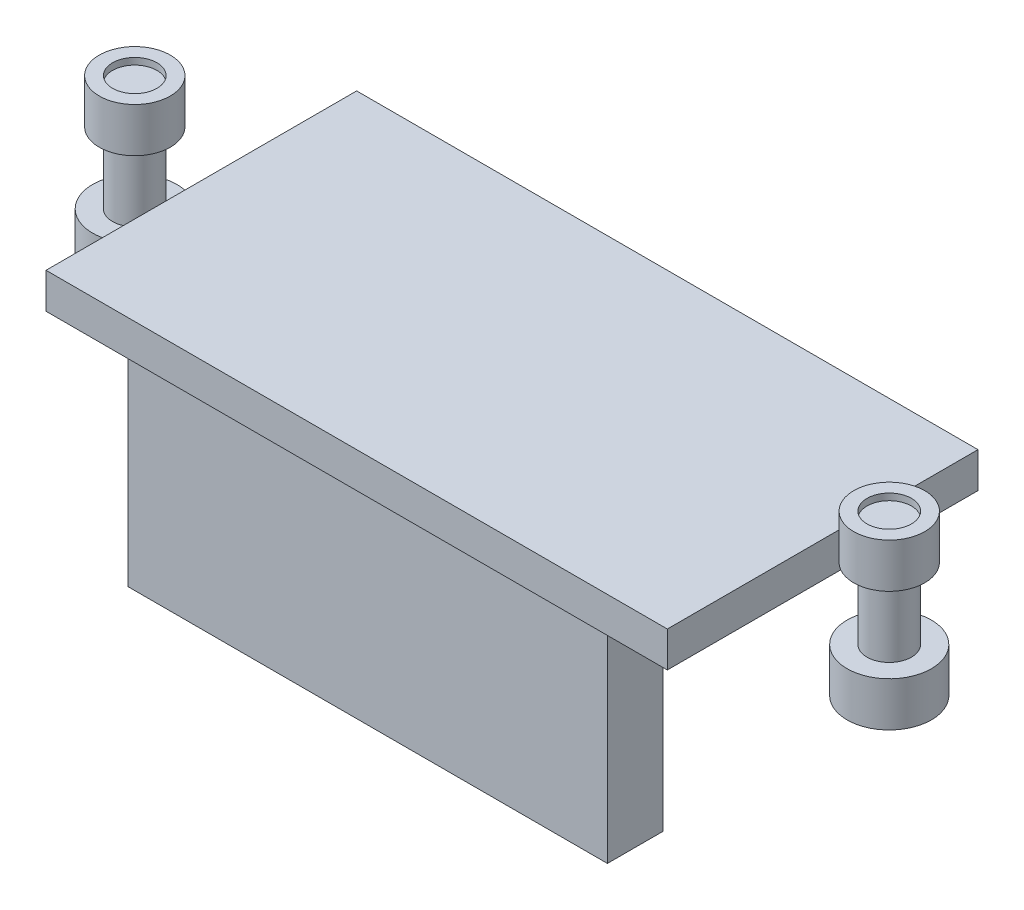
ISO-10303-21;
HEADER;
FILE_DESCRIPTION(('STEP AP214'),'2;1');
FILE_NAME('part.step','',(''),(''),'','','');
FILE_SCHEMA(('AUTOMOTIVE_DESIGN { 1 0 10303 214 1 1 1 1 }'));
ENDSEC;
DATA;
#1=APPLICATION_CONTEXT('core data for automotive mechanical design processes');
#2=APPLICATION_PROTOCOL_DEFINITION('international standard','automotive_design',2000,#1);
#3=PRODUCT_CONTEXT('',#1,'mechanical');
#4=PRODUCT('Part','Part','',(#3));
#5=PRODUCT_RELATED_PRODUCT_CATEGORY('part','',(#4));
#6=PRODUCT_DEFINITION_FORMATION('','',#4);
#7=PRODUCT_DEFINITION_CONTEXT('part definition',#1,'design');
#8=PRODUCT_DEFINITION('design','',#6,#7);
#9=PRODUCT_DEFINITION_SHAPE('','',#8);
#10=(LENGTH_UNIT() NAMED_UNIT(*) SI_UNIT(.MILLI.,.METRE.));
#11=(NAMED_UNIT(*) PLANE_ANGLE_UNIT() SI_UNIT($,.RADIAN.));
#12=(NAMED_UNIT(*) SI_UNIT($,.STERADIAN.) SOLID_ANGLE_UNIT());
#13=UNCERTAINTY_MEASURE_WITH_UNIT(LENGTH_MEASURE(1.E-05),#10,'distance_accuracy_value','');
#14=(GEOMETRIC_REPRESENTATION_CONTEXT(3) GLOBAL_UNCERTAINTY_ASSIGNED_CONTEXT((#13)) GLOBAL_UNIT_ASSIGNED_CONTEXT((#10,
#11,#12)) REPRESENTATION_CONTEXT('',''));
#15=CARTESIAN_POINT('',(0.,0.,0.));
#16=DIRECTION('',(0.,0.,1.));
#17=DIRECTION('',(1.,0.,0.));
#18=AXIS2_PLACEMENT_3D('',#15,#16,#17);
#19=CARTESIAN_POINT('',(-33.00918288317,-244.6,-36.24488287878));
#20=DIRECTION('',(0.,-1.,0.));
#21=DIRECTION('',(0.,0.,-1.));
#22=AXIS2_PLACEMENT_3D('',#19,#20,#21);
#23=PLANE('',#22);
#24=DIRECTION('',(0.,0.,1.));
#25=VECTOR('',#24,1.);
#26=CARTESIAN_POINT('',(-33.00918288317,-244.6,-36.24488287878));
#27=LINE('',#26,#25);
#28=CARTESIAN_POINT('',(-33.00918288317,-244.6,-36.24488287878));
#29=VERTEX_POINT('',#28);
#30=CARTESIAN_POINT('',(-33.00918288317,-244.6,-22.24488287878));
#31=VERTEX_POINT('',#30);
#32=EDGE_CURVE('P0_E83',#29,#31,#27,.T.);
#33=ORIENTED_EDGE('',*,*,#32,.F.);
#34=DIRECTION('',(1.,0.,0.));
#35=VECTOR('',#34,1.);
#36=CARTESIAN_POINT('',(-33.00918288317,-244.6,-36.24488287878));
#37=LINE('',#36,#35);
#38=CARTESIAN_POINT('',(-5.009182883171,-244.6,-36.24488287878));
#39=VERTEX_POINT('',#38);
#40=EDGE_CURVE('P0_E65',#29,#39,#37,.T.);
#41=ORIENTED_EDGE('',*,*,#40,.T.);
#42=DIRECTION('',(0.,0.,1.));
#43=VECTOR('',#42,1.);
#44=CARTESIAN_POINT('',(-5.009182883171,-244.6,-36.24488287878));
#45=LINE('',#44,#43);
#46=CARTESIAN_POINT('',(-5.009182883171,-244.6,-22.24488287878));
#47=VERTEX_POINT('',#46);
#48=EDGE_CURVE('P0_E80',#39,#47,#45,.T.);
#49=ORIENTED_EDGE('',*,*,#48,.T.);
#50=DIRECTION('',(1.,0.,0.));
#51=VECTOR('',#50,1.);
#52=CARTESIAN_POINT('',(-33.00918288317,-244.6,-22.24488287878));
#53=LINE('',#52,#51);
#54=EDGE_CURVE('P0_E11',#31,#47,#53,.T.);
#55=ORIENTED_EDGE('',*,*,#54,.F.);
#56=EDGE_LOOP('',(#33,#41,#49,#55));
#57=FACE_BOUND('',#56,.T.);
#58=ADVANCED_FACE('P0_F17',(#57),#23,.T.);
#59=CARTESIAN_POINT('',(-33.00918288317,-243.,-36.24488287878));
#60=DIRECTION('',(0.,-1.,0.));
#61=DIRECTION('',(0.,0.,-1.));
#62=AXIS2_PLACEMENT_3D('',#59,#60,#61);
#63=PLANE('',#62);
#64=DIRECTION('',(1.,0.,0.));
#65=VECTOR('',#64,1.);
#66=CARTESIAN_POINT('',(-33.00918288317,-243.,-22.24488287878));
#67=LINE('',#66,#65);
#68=CARTESIAN_POINT('',(-33.00918288317,-243.,-22.24488287878));
#69=VERTEX_POINT('',#68);
#70=CARTESIAN_POINT('',(-5.009182883171,-243.,-22.24488287878));
#71=VERTEX_POINT('',#70);
#72=EDGE_CURVE('P0_E27',#69,#71,#67,.T.);
#73=ORIENTED_EDGE('',*,*,#72,.T.);
#74=DIRECTION('',(0.,0.,1.));
#75=VECTOR('',#74,1.);
#76=CARTESIAN_POINT('',(-5.009182883171,-243.,-36.24488287878));
#77=LINE('',#76,#75);
#78=CARTESIAN_POINT('',(-5.009182883171,-243.,-36.24488287878));
#79=VERTEX_POINT('',#78);
#80=EDGE_CURVE('P0_E101',#79,#71,#77,.T.);
#81=ORIENTED_EDGE('',*,*,#80,.F.);
#82=DIRECTION('',(1.,0.,0.));
#83=VECTOR('',#82,1.);
#84=CARTESIAN_POINT('',(-33.00918288317,-243.,-36.24488287878));
#85=LINE('',#84,#83);
#86=CARTESIAN_POINT('',(-33.00918288317,-243.,-36.24488287878));
#87=VERTEX_POINT('',#86);
#88=EDGE_CURVE('P0_E76',#87,#79,#85,.T.);
#89=ORIENTED_EDGE('',*,*,#88,.F.);
#90=DIRECTION('',(0.,0.,1.));
#91=VECTOR('',#90,1.);
#92=CARTESIAN_POINT('',(-33.00918288317,-243.,-36.24488287878));
#93=LINE('',#92,#91);
#94=EDGE_CURVE('P0_E84',#87,#69,#93,.T.);
#95=ORIENTED_EDGE('',*,*,#94,.T.);
#96=EDGE_LOOP('',(#73,#81,#89,#95));
#97=FACE_BOUND('',#96,.T.);
#98=ADVANCED_FACE('P0_F111',(#97),#63,.F.);
#99=CARTESIAN_POINT('',(-33.00918288317,-243.,-22.24488287878));
#100=DIRECTION('',(0.,0.,1.));
#101=DIRECTION('',(1.,0.,0.));
#102=AXIS2_PLACEMENT_3D('',#99,#100,#101);
#103=PLANE('',#102);
#104=ORIENTED_EDGE('',*,*,#72,.F.);
#105=DIRECTION('',(0.,-1.,0.));
#106=VECTOR('',#105,1.);
#107=CARTESIAN_POINT('',(-33.00918288317,-243.,-22.24488287878));
#108=LINE('',#107,#106);
#109=EDGE_CURVE('P0_E90',#69,#31,#108,.T.);
#110=ORIENTED_EDGE('',*,*,#109,.T.);
#111=ORIENTED_EDGE('',*,*,#54,.T.);
#112=DIRECTION('',(0.,-1.,0.));
#113=VECTOR('',#112,1.);
#114=CARTESIAN_POINT('',(-5.009182883171,-243.,-22.24488287878));
#115=LINE('',#114,#113);
#116=EDGE_CURVE('P0_E100',#71,#47,#115,.T.);
#117=ORIENTED_EDGE('',*,*,#116,.F.);
#118=EDGE_LOOP('',(#104,#110,#111,#117));
#119=FACE_BOUND('',#118,.T.);
#120=ADVANCED_FACE('P0_F113',(#119),#103,.T.);
#121=CARTESIAN_POINT('',(-33.00918288317,-243.,-36.24488287878));
#122=DIRECTION('',(0.,0.,1.));
#123=DIRECTION('',(1.,0.,0.));
#124=AXIS2_PLACEMENT_3D('',#121,#122,#123);
#125=PLANE('',#124);
#126=DIRECTION('',(0.,-1.,0.));
#127=VECTOR('',#126,1.);
#128=CARTESIAN_POINT('',(-5.009182883171,-243.,-36.24488287878));
#129=LINE('',#128,#127);
#130=EDGE_CURVE('P0_E75',#79,#39,#129,.T.);
#131=ORIENTED_EDGE('',*,*,#130,.T.);
#132=ORIENTED_EDGE('',*,*,#40,.F.);
#133=DIRECTION('',(0.,-1.,0.));
#134=VECTOR('',#133,1.);
#135=CARTESIAN_POINT('',(-33.00918288317,-243.,-36.24488287878));
#136=LINE('',#135,#134);
#137=EDGE_CURVE('P0_E68',#87,#29,#136,.T.);
#138=ORIENTED_EDGE('',*,*,#137,.F.);
#139=ORIENTED_EDGE('',*,*,#88,.T.);
#140=EDGE_LOOP('',(#131,#132,#138,#139));
#141=FACE_BOUND('',#140,.T.);
#142=ADVANCED_FACE('P0_F70',(#141),#125,.F.);
#143=CARTESIAN_POINT('',(-5.009182883171,-243.,-36.24488287878));
#144=DIRECTION('',(1.,0.,0.));
#145=DIRECTION('',(0.,1.,0.));
#146=AXIS2_PLACEMENT_3D('',#143,#144,#145);
#147=PLANE('',#146);
#148=ORIENTED_EDGE('',*,*,#130,.F.);
#149=ORIENTED_EDGE('',*,*,#80,.T.);
#150=ORIENTED_EDGE('',*,*,#116,.T.);
#151=ORIENTED_EDGE('',*,*,#48,.F.);
#152=EDGE_LOOP('',(#148,#149,#150,#151));
#153=FACE_BOUND('',#152,.T.);
#154=ADVANCED_FACE('P0_F117',(#153),#147,.T.);
#155=CARTESIAN_POINT('',(-33.00918288317,-243.,-36.24488287878));
#156=DIRECTION('',(1.,0.,0.));
#157=DIRECTION('',(0.,1.,0.));
#158=AXIS2_PLACEMENT_3D('',#155,#156,#157);
#159=PLANE('',#158);
#160=ORIENTED_EDGE('',*,*,#32,.T.);
#161=ORIENTED_EDGE('',*,*,#109,.F.);
#162=ORIENTED_EDGE('',*,*,#94,.F.);
#163=ORIENTED_EDGE('',*,*,#137,.T.);
#164=EDGE_LOOP('',(#160,#161,#162,#163));
#165=FACE_BOUND('',#164,.T.);
#166=ADVANCED_FACE('P0_F81',(#165),#159,.F.);
#167=CLOSED_SHELL('',(#58,#98,#120,#142,#154,#166));
#168=MANIFOLD_SOLID_BREP('P0_B1',#167);
#169=CARTESIAN_POINT('',(-21.50918288317,-245.6,-30.74488287878));
#170=DIRECTION('',(0.,-1.,0.));
#171=DIRECTION('',(0.,0.,-1.));
#172=AXIS2_PLACEMENT_3D('',#169,#170,#171);
#173=PLANE('',#172);
#174=DIRECTION('',(0.,0.,1.));
#175=VECTOR('',#174,1.);
#176=CARTESIAN_POINT('',(-21.50918288317,-245.6,-30.74488287878));
#177=LINE('',#176,#175);
#178=CARTESIAN_POINT('',(-21.50918288317,-245.6,-30.74488287878));
#179=VERTEX_POINT('',#178);
#180=CARTESIAN_POINT('',(-21.50918288317,-245.6,-27.74488287878));
#181=VERTEX_POINT('',#180);
#182=EDGE_CURVE('P1_E69',#179,#181,#177,.T.);
#183=ORIENTED_EDGE('',*,*,#182,.F.);
#184=DIRECTION('',(1.,0.,0.));
#185=VECTOR('',#184,1.);
#186=CARTESIAN_POINT('',(-21.50918288317,-245.6,-30.74488287878));
#187=LINE('',#186,#185);
#188=CARTESIAN_POINT('',(-16.50918288317,-245.6,-30.74488287878));
#189=VERTEX_POINT('',#188);
#190=EDGE_CURVE('P1_E65',#179,#189,#187,.T.);
#191=ORIENTED_EDGE('',*,*,#190,.T.);
#192=DIRECTION('',(0.,0.,1.));
#193=VECTOR('',#192,1.);
#194=CARTESIAN_POINT('',(-16.50918288317,-245.6,-30.74488287878));
#195=LINE('',#194,#193);
#196=CARTESIAN_POINT('',(-16.50918288317,-245.6,-27.74488287878));
#197=VERTEX_POINT('',#196);
#198=EDGE_CURVE('P1_E70',#189,#197,#195,.T.);
#199=ORIENTED_EDGE('',*,*,#198,.T.);
#200=DIRECTION('',(1.,0.,0.));
#201=VECTOR('',#200,1.);
#202=CARTESIAN_POINT('',(-21.50918288317,-245.6,-27.74488287878));
#203=LINE('',#202,#201);
#204=EDGE_CURVE('P1_E11',#181,#197,#203,.T.);
#205=ORIENTED_EDGE('',*,*,#204,.F.);
#206=EDGE_LOOP('',(#183,#191,#199,#205));
#207=FACE_BOUND('',#206,.T.);
#208=ADVANCED_FACE('P1_F17',(#207),#173,.T.);
#209=CARTESIAN_POINT('',(-21.50918288317,-244.6,-30.74488287878));
#210=DIRECTION('',(0.,-1.,0.));
#211=DIRECTION('',(0.,0.,-1.));
#212=AXIS2_PLACEMENT_3D('',#209,#210,#211);
#213=PLANE('',#212);
#214=DIRECTION('',(1.,0.,0.));
#215=VECTOR('',#214,1.);
#216=CARTESIAN_POINT('',(-21.50918288317,-244.6,-27.74488287878));
#217=LINE('',#216,#215);
#218=CARTESIAN_POINT('',(-21.50918288317,-244.6,-27.74488287878));
#219=VERTEX_POINT('',#218);
#220=CARTESIAN_POINT('',(-16.50918288317,-244.6,-27.74488287878));
#221=VERTEX_POINT('',#220);
#222=EDGE_CURVE('P1_E20',#219,#221,#217,.T.);
#223=ORIENTED_EDGE('',*,*,#222,.T.);
#224=DIRECTION('',(0.,0.,1.));
#225=VECTOR('',#224,1.);
#226=CARTESIAN_POINT('',(-16.50918288317,-244.6,-30.74488287878));
#227=LINE('',#226,#225);
#228=CARTESIAN_POINT('',(-16.50918288317,-244.6,-30.74488287878));
#229=VERTEX_POINT('',#228);
#230=EDGE_CURVE('P1_E90',#229,#221,#227,.T.);
#231=ORIENTED_EDGE('',*,*,#230,.F.);
#232=DIRECTION('',(1.,0.,0.));
#233=VECTOR('',#232,1.);
#234=CARTESIAN_POINT('',(-21.50918288317,-244.6,-30.74488287878));
#235=LINE('',#234,#233);
#236=CARTESIAN_POINT('',(-21.50918288317,-244.6,-30.74488287878));
#237=VERTEX_POINT('',#236);
#238=EDGE_CURVE('P1_E76',#237,#229,#235,.T.);
#239=ORIENTED_EDGE('',*,*,#238,.F.);
#240=DIRECTION('',(0.,0.,1.));
#241=VECTOR('',#240,1.);
#242=CARTESIAN_POINT('',(-21.50918288317,-244.6,-30.74488287878));
#243=LINE('',#242,#241);
#244=EDGE_CURVE('P1_E96',#237,#219,#243,.T.);
#245=ORIENTED_EDGE('',*,*,#244,.T.);
#246=EDGE_LOOP('',(#223,#231,#239,#245));
#247=FACE_BOUND('',#246,.T.);
#248=ADVANCED_FACE('P1_F104',(#247),#213,.F.);
#249=CARTESIAN_POINT('',(-21.50918288317,-244.6,-27.74488287878));
#250=DIRECTION('',(0.,0.,1.));
#251=DIRECTION('',(1.,0.,0.));
#252=AXIS2_PLACEMENT_3D('',#249,#250,#251);
#253=PLANE('',#252);
#254=ORIENTED_EDGE('',*,*,#222,.F.);
#255=DIRECTION('',(0.,-1.,0.));
#256=VECTOR('',#255,1.);
#257=CARTESIAN_POINT('',(-21.50918288317,-244.6,-27.74488287878));
#258=LINE('',#257,#256);
#259=EDGE_CURVE('P1_E116',#219,#181,#258,.T.);
#260=ORIENTED_EDGE('',*,*,#259,.T.);
#261=ORIENTED_EDGE('',*,*,#204,.T.);
#262=DIRECTION('',(0.,-1.,0.));
#263=VECTOR('',#262,1.);
#264=CARTESIAN_POINT('',(-16.50918288317,-244.6,-27.74488287878));
#265=LINE('',#264,#263);
#266=EDGE_CURVE('P1_E83',#221,#197,#265,.T.);
#267=ORIENTED_EDGE('',*,*,#266,.F.);
#268=EDGE_LOOP('',(#254,#260,#261,#267));
#269=FACE_BOUND('',#268,.T.);
#270=ADVANCED_FACE('P1_F107',(#269),#253,.T.);
#271=CARTESIAN_POINT('',(-21.50918288317,-244.6,-30.74488287878));
#272=DIRECTION('',(0.,0.,1.));
#273=DIRECTION('',(1.,0.,0.));
#274=AXIS2_PLACEMENT_3D('',#271,#272,#273);
#275=PLANE('',#274);
#276=DIRECTION('',(0.,-1.,0.));
#277=VECTOR('',#276,1.);
#278=CARTESIAN_POINT('',(-16.50918288317,-244.6,-30.74488287878));
#279=LINE('',#278,#277);
#280=EDGE_CURVE('P1_E85',#229,#189,#279,.T.);
#281=ORIENTED_EDGE('',*,*,#280,.T.);
#282=ORIENTED_EDGE('',*,*,#190,.F.);
#283=DIRECTION('',(0.,-1.,0.));
#284=VECTOR('',#283,1.);
#285=CARTESIAN_POINT('',(-21.50918288317,-244.6,-30.74488287878));
#286=LINE('',#285,#284);
#287=EDGE_CURVE('P1_E89',#237,#179,#286,.T.);
#288=ORIENTED_EDGE('',*,*,#287,.F.);
#289=ORIENTED_EDGE('',*,*,#238,.T.);
#290=EDGE_LOOP('',(#281,#282,#288,#289));
#291=FACE_BOUND('',#290,.T.);
#292=ADVANCED_FACE('P1_F88',(#291),#275,.F.);
#293=CARTESIAN_POINT('',(-16.50918288317,-244.6,-30.74488287878));
#294=DIRECTION('',(1.,0.,0.));
#295=DIRECTION('',(0.,1.,0.));
#296=AXIS2_PLACEMENT_3D('',#293,#294,#295);
#297=PLANE('',#296);
#298=ORIENTED_EDGE('',*,*,#280,.F.);
#299=ORIENTED_EDGE('',*,*,#230,.T.);
#300=ORIENTED_EDGE('',*,*,#266,.T.);
#301=ORIENTED_EDGE('',*,*,#198,.F.);
#302=EDGE_LOOP('',(#298,#299,#300,#301));
#303=FACE_BOUND('',#302,.T.);
#304=ADVANCED_FACE('P1_F79',(#303),#297,.T.);
#305=CARTESIAN_POINT('',(-21.50918288317,-244.6,-30.74488287878));
#306=DIRECTION('',(1.,0.,0.));
#307=DIRECTION('',(0.,1.,0.));
#308=AXIS2_PLACEMENT_3D('',#305,#306,#307);
#309=PLANE('',#308);
#310=ORIENTED_EDGE('',*,*,#182,.T.);
#311=ORIENTED_EDGE('',*,*,#259,.F.);
#312=ORIENTED_EDGE('',*,*,#244,.F.);
#313=ORIENTED_EDGE('',*,*,#287,.T.);
#314=EDGE_LOOP('',(#310,#311,#312,#313));
#315=FACE_BOUND('',#314,.T.);
#316=ADVANCED_FACE('P1_F123',(#315),#309,.F.);
#317=CLOSED_SHELL('',(#208,#248,#270,#292,#304,#316));
#318=MANIFOLD_SOLID_BREP('P1_B1',#317);
#319=CARTESIAN_POINT('',(-29.80918288317,-254.,-25.24488287878));
#320=DIRECTION('',(0.,-1.,0.));
#321=DIRECTION('',(0.,0.,-1.));
#322=AXIS2_PLACEMENT_3D('',#319,#320,#321);
#323=PLANE('',#322);
#324=DIRECTION('',(0.,0.,1.));
#325=VECTOR('',#324,1.);
#326=CARTESIAN_POINT('',(-29.80918288317,-254.,-25.24488287878));
#327=LINE('',#326,#325);
#328=CARTESIAN_POINT('',(-29.80918288317,-254.,-25.24488287878));
#329=VERTEX_POINT('',#328);
#330=CARTESIAN_POINT('',(-29.80918288317,-254.,-22.74488287878));
#331=VERTEX_POINT('',#330);
#332=EDGE_CURVE('P2_E90',#329,#331,#327,.T.);
#333=ORIENTED_EDGE('',*,*,#332,.F.);
#334=DIRECTION('',(1.,0.,0.));
#335=VECTOR('',#334,1.);
#336=CARTESIAN_POINT('',(-29.80918288317,-254.,-25.24488287878));
#337=LINE('',#336,#335);
#338=CARTESIAN_POINT('',(-8.209182883171,-254.,-25.24488287878));
#339=VERTEX_POINT('',#338);
#340=EDGE_CURVE('P2_E75',#329,#339,#337,.T.);
#341=ORIENTED_EDGE('',*,*,#340,.T.);
#342=DIRECTION('',(0.,0.,1.));
#343=VECTOR('',#342,1.);
#344=CARTESIAN_POINT('',(-8.209182883171,-254.,-25.24488287878));
#345=LINE('',#344,#343);
#346=CARTESIAN_POINT('',(-8.209182883171,-254.,-22.74488287878));
#347=VERTEX_POINT('',#346);
#348=EDGE_CURVE('P2_E83',#339,#347,#345,.T.);
#349=ORIENTED_EDGE('',*,*,#348,.T.);
#350=DIRECTION('',(1.,0.,0.));
#351=VECTOR('',#350,1.);
#352=CARTESIAN_POINT('',(-29.80918288317,-254.,-22.74488287878));
#353=LINE('',#352,#351);
#354=EDGE_CURVE('P2_E11',#331,#347,#353,.T.);
#355=ORIENTED_EDGE('',*,*,#354,.F.);
#356=EDGE_LOOP('',(#333,#341,#349,#355));
#357=FACE_BOUND('',#356,.T.);
#358=ADVANCED_FACE('P2_F17',(#357),#323,.T.);
#359=CARTESIAN_POINT('',(-29.80918288317,-244.6,-25.24488287878));
#360=DIRECTION('',(0.,-1.,0.));
#361=DIRECTION('',(0.,0.,-1.));
#362=AXIS2_PLACEMENT_3D('',#359,#360,#361);
#363=PLANE('',#362);
#364=DIRECTION('',(1.,0.,0.));
#365=VECTOR('',#364,1.);
#366=CARTESIAN_POINT('',(-29.80918288317,-244.6,-22.74488287878));
#367=LINE('',#366,#365);
#368=CARTESIAN_POINT('',(-29.80918288317,-244.6,-22.74488287878));
#369=VERTEX_POINT('',#368);
#370=CARTESIAN_POINT('',(-8.209182883171,-244.6,-22.74488287878));
#371=VERTEX_POINT('',#370);
#372=EDGE_CURVE('P2_E20',#369,#371,#367,.T.);
#373=ORIENTED_EDGE('',*,*,#372,.T.);
#374=DIRECTION('',(0.,0.,1.));
#375=VECTOR('',#374,1.);
#376=CARTESIAN_POINT('',(-8.209182883171,-244.6,-25.24488287878));
#377=LINE('',#376,#375);
#378=CARTESIAN_POINT('',(-8.209182883171,-244.6,-25.24488287878));
#379=VERTEX_POINT('',#378);
#380=EDGE_CURVE('P2_E102',#379,#371,#377,.T.);
#381=ORIENTED_EDGE('',*,*,#380,.F.);
#382=DIRECTION('',(1.,0.,0.));
#383=VECTOR('',#382,1.);
#384=CARTESIAN_POINT('',(-29.80918288317,-244.6,-25.24488287878));
#385=LINE('',#384,#383);
#386=CARTESIAN_POINT('',(-29.80918288317,-244.6,-25.24488287878));
#387=VERTEX_POINT('',#386);
#388=EDGE_CURVE('P2_E85',#387,#379,#385,.T.);
#389=ORIENTED_EDGE('',*,*,#388,.F.);
#390=DIRECTION('',(0.,0.,1.));
#391=VECTOR('',#390,1.);
#392=CARTESIAN_POINT('',(-29.80918288317,-244.6,-25.24488287878));
#393=LINE('',#392,#391);
#394=EDGE_CURVE('P2_E89',#387,#369,#393,.T.);
#395=ORIENTED_EDGE('',*,*,#394,.T.);
#396=EDGE_LOOP('',(#373,#381,#389,#395));
#397=FACE_BOUND('',#396,.T.);
#398=ADVANCED_FACE('P2_F149',(#397),#363,.F.);
#399=CARTESIAN_POINT('',(-29.80918288317,-244.6,-22.74488287878));
#400=DIRECTION('',(0.,0.,1.));
#401=DIRECTION('',(1.,0.,0.));
#402=AXIS2_PLACEMENT_3D('',#399,#400,#401);
#403=PLANE('',#402);
#404=ORIENTED_EDGE('',*,*,#372,.F.);
#405=DIRECTION('',(0.,-1.,0.));
#406=VECTOR('',#405,1.);
#407=CARTESIAN_POINT('',(-29.80918288317,-244.6,-22.74488287878));
#408=LINE('',#407,#406);
#409=EDGE_CURVE('P2_E94',#369,#331,#408,.T.);
#410=ORIENTED_EDGE('',*,*,#409,.T.);
#411=ORIENTED_EDGE('',*,*,#354,.T.);
#412=DIRECTION('',(0.,-1.,0.));
#413=VECTOR('',#412,1.);
#414=CARTESIAN_POINT('',(-8.209182883171,-244.6,-22.74488287878));
#415=LINE('',#414,#413);
#416=EDGE_CURVE('P2_E107',#371,#347,#415,.T.);
#417=ORIENTED_EDGE('',*,*,#416,.F.);
#418=EDGE_LOOP('',(#404,#410,#411,#417));
#419=FACE_BOUND('',#418,.T.);
#420=ADVANCED_FACE('P2_F143',(#419),#403,.T.);
#421=CARTESIAN_POINT('',(-29.80918288317,-244.6,-25.24488287878));
#422=DIRECTION('',(0.,0.,1.));
#423=DIRECTION('',(1.,0.,0.));
#424=AXIS2_PLACEMENT_3D('',#421,#422,#423);
#425=PLANE('',#424);
#426=DIRECTION('',(0.,-1.,0.));
#427=VECTOR('',#426,1.);
#428=CARTESIAN_POINT('',(-8.209182883171,-244.6,-25.24488287878));
#429=LINE('',#428,#427);
#430=EDGE_CURVE('P2_E80',#379,#339,#429,.T.);
#431=ORIENTED_EDGE('',*,*,#430,.T.);
#432=ORIENTED_EDGE('',*,*,#340,.F.);
#433=DIRECTION('',(0.,-1.,0.));
#434=VECTOR('',#433,1.);
#435=CARTESIAN_POINT('',(-29.80918288317,-244.6,-25.24488287878));
#436=LINE('',#435,#434);
#437=EDGE_CURVE('P2_E72',#387,#329,#436,.T.);
#438=ORIENTED_EDGE('',*,*,#437,.F.);
#439=ORIENTED_EDGE('',*,*,#388,.T.);
#440=EDGE_LOOP('',(#431,#432,#438,#439));
#441=FACE_BOUND('',#440,.T.);
#442=ADVANCED_FACE('P2_F73',(#441),#425,.F.);
#443=CARTESIAN_POINT('',(-8.209182883171,-244.6,-25.24488287878));
#444=DIRECTION('',(1.,0.,0.));
#445=DIRECTION('',(0.,1.,0.));
#446=AXIS2_PLACEMENT_3D('',#443,#444,#445);
#447=PLANE('',#446);
#448=ORIENTED_EDGE('',*,*,#430,.F.);
#449=ORIENTED_EDGE('',*,*,#380,.T.);
#450=ORIENTED_EDGE('',*,*,#416,.T.);
#451=ORIENTED_EDGE('',*,*,#348,.F.);
#452=EDGE_LOOP('',(#448,#449,#450,#451));
#453=FACE_BOUND('',#452,.T.);
#454=ADVANCED_FACE('P2_F122',(#453),#447,.T.);
#455=CARTESIAN_POINT('',(-29.80918288317,-244.6,-25.24488287878));
#456=DIRECTION('',(1.,0.,0.));
#457=DIRECTION('',(0.,1.,0.));
#458=AXIS2_PLACEMENT_3D('',#455,#456,#457);
#459=PLANE('',#458);
#460=ORIENTED_EDGE('',*,*,#332,.T.);
#461=ORIENTED_EDGE('',*,*,#409,.F.);
#462=ORIENTED_EDGE('',*,*,#394,.F.);
#463=ORIENTED_EDGE('',*,*,#437,.T.);
#464=EDGE_LOOP('',(#460,#461,#462,#463));
#465=FACE_BOUND('',#464,.T.);
#466=ADVANCED_FACE('P2_F87',(#465),#459,.F.);
#467=CLOSED_SHELL('',(#358,#398,#420,#442,#454,#466));
#468=MANIFOLD_SOLID_BREP('P2_B1',#467);
#469=CARTESIAN_POINT('',(-36.00918288317,-240.3,-29.24488287878));
#470=DIRECTION('',(0.,-1.,0.));
#471=DIRECTION('',(1.,0.,0.));
#472=AXIS2_PLACEMENT_3D('',#469,#470,#471);
#473=CYLINDRICAL_SURFACE('',#472,1.);
#474=CARTESIAN_POINT('',(-36.00918288317,-242.4,-29.24488287878));
#475=DIRECTION('',(0.,-1.,0.));
#476=DIRECTION('',(1.,0.,0.));
#477=AXIS2_PLACEMENT_3D('',#474,#475,#476);
#478=CIRCLE('',#477,1.);
#479=CARTESIAN_POINT('',(-35.00918288317,-242.4,-29.24488287878));
#480=VERTEX_POINT('',#479);
#481=EDGE_CURVE('P3_E22',#480,#480,#478,.T.);
#482=ORIENTED_EDGE('',*,*,#481,.T.);
#483=EDGE_LOOP('',(#482));
#484=FACE_BOUND('',#483,.T.);
#485=CARTESIAN_POINT('',(-36.00918288317,-240.4,-29.24488287878));
#486=DIRECTION('',(0.,-1.,0.));
#487=DIRECTION('',(1.,0.,0.));
#488=AXIS2_PLACEMENT_3D('',#485,#486,#487);
#489=CIRCLE('',#488,1.);
#490=CARTESIAN_POINT('',(-35.00918288317,-240.4,-29.24488287878));
#491=VERTEX_POINT('',#490);
#492=EDGE_CURVE('P3_E10',#491,#491,#489,.T.);
#493=ORIENTED_EDGE('',*,*,#492,.F.);
#494=EDGE_LOOP('',(#493));
#495=FACE_BOUND('',#494,.T.);
#496=ADVANCED_FACE('P3_F15',(#484,#495),#473,.F.);
#497=CARTESIAN_POINT('',(-36.00918288317,-240.4,-29.24488287878));
#498=DIRECTION('',(0.,-1.,0.));
#499=DIRECTION('',(0.,0.,-1.));
#500=AXIS2_PLACEMENT_3D('',#497,#498,#499);
#501=PLANE('',#500);
#502=ORIENTED_EDGE('',*,*,#492,.T.);
#503=EDGE_LOOP('',(#502));
#504=FACE_BOUND('',#503,.T.);
#505=CARTESIAN_POINT('',(-36.00918288317,-240.4,-29.24488287878));
#506=DIRECTION('',(0.,-1.,0.));
#507=DIRECTION('',(1.,0.,0.));
#508=AXIS2_PLACEMENT_3D('',#505,#506,#507);
#509=CIRCLE('',#508,1.6);
#510=CARTESIAN_POINT('',(-34.40918288317,-240.4,-29.24488287878));
#511=VERTEX_POINT('',#510);
#512=EDGE_CURVE('P3_E28',#511,#511,#509,.T.);
#513=ORIENTED_EDGE('',*,*,#512,.F.);
#514=EDGE_LOOP('',(#513));
#515=FACE_BOUND('',#514,.T.);
#516=ADVANCED_FACE('P3_F55',(#504,#515),#501,.F.);
#517=CARTESIAN_POINT('',(-36.00918288317,-242.4,-29.24488287878));
#518=DIRECTION('',(0.,-1.,0.));
#519=DIRECTION('',(0.,0.,-1.));
#520=AXIS2_PLACEMENT_3D('',#517,#518,#519);
#521=PLANE('',#520);
#522=ORIENTED_EDGE('',*,*,#481,.F.);
#523=EDGE_LOOP('',(#522));
#524=FACE_BOUND('',#523,.T.);
#525=CARTESIAN_POINT('',(-36.00918288317,-242.4,-29.24488287878));
#526=DIRECTION('',(0.,-1.,0.));
#527=DIRECTION('',(1.,0.,0.));
#528=AXIS2_PLACEMENT_3D('',#525,#526,#527);
#529=CIRCLE('',#528,1.6);
#530=CARTESIAN_POINT('',(-34.40918288317,-242.4,-29.24488287878));
#531=VERTEX_POINT('',#530);
#532=EDGE_CURVE('P3_E38',#531,#531,#529,.T.);
#533=ORIENTED_EDGE('',*,*,#532,.T.);
#534=EDGE_LOOP('',(#533));
#535=FACE_BOUND('',#534,.T.);
#536=ADVANCED_FACE('P3_F42',(#524,#535),#521,.T.);
#537=CARTESIAN_POINT('',(-36.00918288317,-240.4,-29.24488287878));
#538=DIRECTION('',(0.,-1.,0.));
#539=DIRECTION('',(1.,0.,0.));
#540=AXIS2_PLACEMENT_3D('',#537,#538,#539);
#541=CYLINDRICAL_SURFACE('',#540,1.6);
#542=ORIENTED_EDGE('',*,*,#532,.F.);
#543=EDGE_LOOP('',(#542));
#544=FACE_BOUND('',#543,.T.);
#545=ORIENTED_EDGE('',*,*,#512,.T.);
#546=EDGE_LOOP('',(#545));
#547=FACE_BOUND('',#546,.T.);
#548=ADVANCED_FACE('P3_F46',(#544,#547),#541,.T.);
#549=CLOSED_SHELL('',(#496,#516,#536,#548));
#550=MANIFOLD_SOLID_BREP('P3_B1',#549);
#551=CARTESIAN_POINT('',(-36.00918288317,-247.6,-29.24488287878));
#552=DIRECTION('',(0.,-1.,0.));
#553=DIRECTION('',(0.,0.,-1.));
#554=AXIS2_PLACEMENT_3D('',#551,#552,#553);
#555=PLANE('',#554);
#556=CARTESIAN_POINT('',(-36.00918288317,-247.6,-29.24488287878));
#557=DIRECTION('',(0.,-1.,0.));
#558=DIRECTION('',(1.,0.,0.));
#559=AXIS2_PLACEMENT_3D('',#556,#557,#558);
#560=CIRCLE('',#559,1.9);
#561=CARTESIAN_POINT('',(-34.10918288317,-247.6,-29.24488287878));
#562=VERTEX_POINT('',#561);
#563=EDGE_CURVE('P4_E10',#562,#562,#560,.T.);
#564=ORIENTED_EDGE('',*,*,#563,.T.);
#565=EDGE_LOOP('',(#564));
#566=FACE_BOUND('',#565,.T.);
#567=ADVANCED_FACE('P4_F15',(#566),#555,.T.);
#568=CARTESIAN_POINT('',(-36.00918288317,-245.6,-29.24488287878));
#569=DIRECTION('',(0.,-1.,0.));
#570=DIRECTION('',(1.,0.,0.));
#571=AXIS2_PLACEMENT_3D('',#568,#569,#570);
#572=CYLINDRICAL_SURFACE('',#571,1.9);
#573=ORIENTED_EDGE('',*,*,#563,.F.);
#574=EDGE_LOOP('',(#573));
#575=FACE_BOUND('',#574,.T.);
#576=CARTESIAN_POINT('',(-36.00918288317,-245.6,-29.24488287878));
#577=DIRECTION('',(0.,-1.,0.));
#578=DIRECTION('',(1.,0.,0.));
#579=AXIS2_PLACEMENT_3D('',#576,#577,#578);
#580=CIRCLE('',#579,1.9);
#581=CARTESIAN_POINT('',(-34.10918288317,-245.6,-29.24488287878));
#582=VERTEX_POINT('',#581);
#583=EDGE_CURVE('P4_E22',#582,#582,#580,.T.);
#584=ORIENTED_EDGE('',*,*,#583,.T.);
#585=EDGE_LOOP('',(#584));
#586=FACE_BOUND('',#585,.T.);
#587=ADVANCED_FACE('P4_F54',(#575,#586),#572,.T.);
#588=CARTESIAN_POINT('',(-36.00918288317,-240.7,-29.24488287878));
#589=DIRECTION('',(0.,-1.,0.));
#590=DIRECTION('',(0.,0.,-1.));
#591=AXIS2_PLACEMENT_3D('',#588,#589,#590);
#592=PLANE('',#591);
#593=CARTESIAN_POINT('',(-36.00918288317,-240.7,-29.24488287878));
#594=DIRECTION('',(0.,-1.,0.));
#595=DIRECTION('',(1.,0.,0.));
#596=AXIS2_PLACEMENT_3D('',#593,#594,#595);
#597=CIRCLE('',#596,1.);
#598=CARTESIAN_POINT('',(-35.00918288317,-240.7,-29.24488287878));
#599=VERTEX_POINT('',#598);
#600=EDGE_CURVE('P4_E28',#599,#599,#597,.T.);
#601=ORIENTED_EDGE('',*,*,#600,.F.);
#602=EDGE_LOOP('',(#601));
#603=FACE_BOUND('',#602,.T.);
#604=ADVANCED_FACE('P4_F52',(#603),#592,.F.);
#605=CARTESIAN_POINT('',(-36.00918288317,-245.6,-29.24488287878));
#606=DIRECTION('',(0.,-1.,0.));
#607=DIRECTION('',(0.,0.,-1.));
#608=AXIS2_PLACEMENT_3D('',#605,#606,#607);
#609=PLANE('',#608);
#610=CARTESIAN_POINT('',(-36.00918288317,-245.6,-29.24488287878));
#611=DIRECTION('',(0.,-1.,0.));
#612=DIRECTION('',(1.,0.,0.));
#613=AXIS2_PLACEMENT_3D('',#610,#611,#612);
#614=CIRCLE('',#613,1.);
#615=CARTESIAN_POINT('',(-35.00918288317,-245.6,-29.24488287878));
#616=VERTEX_POINT('',#615);
#617=EDGE_CURVE('P4_E38',#616,#616,#614,.T.);
#618=ORIENTED_EDGE('',*,*,#617,.T.);
#619=EDGE_LOOP('',(#618));
#620=FACE_BOUND('',#619,.T.);
#621=ORIENTED_EDGE('',*,*,#583,.F.);
#622=EDGE_LOOP('',(#621));
#623=FACE_BOUND('',#622,.T.);
#624=ADVANCED_FACE('P4_F42',(#620,#623),#609,.F.);
#625=CARTESIAN_POINT('',(-36.00918288317,-240.7,-29.24488287878));
#626=DIRECTION('',(0.,-1.,0.));
#627=DIRECTION('',(1.,0.,0.));
#628=AXIS2_PLACEMENT_3D('',#625,#626,#627);
#629=CYLINDRICAL_SURFACE('',#628,1.);
#630=ORIENTED_EDGE('',*,*,#617,.F.);
#631=EDGE_LOOP('',(#630));
#632=FACE_BOUND('',#631,.T.);
#633=ORIENTED_EDGE('',*,*,#600,.T.);
#634=EDGE_LOOP('',(#633));
#635=FACE_BOUND('',#634,.T.);
#636=ADVANCED_FACE('P4_F50',(#632,#635),#629,.T.);
#637=CLOSED_SHELL('',(#567,#587,#604,#624,#636));
#638=MANIFOLD_SOLID_BREP('P4_B1',#637);
#639=CARTESIAN_POINT('',(-2.009182883171,-240.3,-29.24488287878));
#640=DIRECTION('',(0.,-1.,0.));
#641=DIRECTION('',(1.,0.,0.));
#642=AXIS2_PLACEMENT_3D('',#639,#640,#641);
#643=CYLINDRICAL_SURFACE('',#642,1.);
#644=CARTESIAN_POINT('',(-2.009182883171,-242.4,-29.24488287878));
#645=DIRECTION('',(0.,-1.,0.));
#646=DIRECTION('',(1.,0.,0.));
#647=AXIS2_PLACEMENT_3D('',#644,#645,#646);
#648=CIRCLE('',#647,1.);
#649=CARTESIAN_POINT('',(-1.009182883171,-242.4,-29.24488287878));
#650=VERTEX_POINT('',#649);
#651=EDGE_CURVE('P5_E22',#650,#650,#648,.T.);
#652=ORIENTED_EDGE('',*,*,#651,.T.);
#653=EDGE_LOOP('',(#652));
#654=FACE_BOUND('',#653,.T.);
#655=CARTESIAN_POINT('',(-2.009182883171,-240.4,-29.24488287878));
#656=DIRECTION('',(0.,-1.,0.));
#657=DIRECTION('',(1.,0.,0.));
#658=AXIS2_PLACEMENT_3D('',#655,#656,#657);
#659=CIRCLE('',#658,1.);
#660=CARTESIAN_POINT('',(-1.009182883171,-240.4,-29.24488287878));
#661=VERTEX_POINT('',#660);
#662=EDGE_CURVE('P5_E10',#661,#661,#659,.T.);
#663=ORIENTED_EDGE('',*,*,#662,.F.);
#664=EDGE_LOOP('',(#663));
#665=FACE_BOUND('',#664,.T.);
#666=ADVANCED_FACE('P5_F15',(#654,#665),#643,.F.);
#667=CARTESIAN_POINT('',(-2.009182883171,-240.4,-29.24488287878));
#668=DIRECTION('',(0.,-1.,0.));
#669=DIRECTION('',(0.,0.,-1.));
#670=AXIS2_PLACEMENT_3D('',#667,#668,#669);
#671=PLANE('',#670);
#672=ORIENTED_EDGE('',*,*,#662,.T.);
#673=EDGE_LOOP('',(#672));
#674=FACE_BOUND('',#673,.T.);
#675=CARTESIAN_POINT('',(-2.009182883171,-240.4,-29.24488287878));
#676=DIRECTION('',(0.,-1.,0.));
#677=DIRECTION('',(1.,0.,0.));
#678=AXIS2_PLACEMENT_3D('',#675,#676,#677);
#679=CIRCLE('',#678,1.6);
#680=CARTESIAN_POINT('',(-0.409182883171,-240.4,-29.24488287878));
#681=VERTEX_POINT('',#680);
#682=EDGE_CURVE('P5_E28',#681,#681,#679,.T.);
#683=ORIENTED_EDGE('',*,*,#682,.F.);
#684=EDGE_LOOP('',(#683));
#685=FACE_BOUND('',#684,.T.);
#686=ADVANCED_FACE('P5_F55',(#674,#685),#671,.F.);
#687=CARTESIAN_POINT('',(-2.009182883171,-242.4,-29.24488287878));
#688=DIRECTION('',(0.,-1.,0.));
#689=DIRECTION('',(0.,0.,-1.));
#690=AXIS2_PLACEMENT_3D('',#687,#688,#689);
#691=PLANE('',#690);
#692=ORIENTED_EDGE('',*,*,#651,.F.);
#693=EDGE_LOOP('',(#692));
#694=FACE_BOUND('',#693,.T.);
#695=CARTESIAN_POINT('',(-2.009182883171,-242.4,-29.24488287878));
#696=DIRECTION('',(0.,-1.,0.));
#697=DIRECTION('',(1.,0.,0.));
#698=AXIS2_PLACEMENT_3D('',#695,#696,#697);
#699=CIRCLE('',#698,1.6);
#700=CARTESIAN_POINT('',(-0.409182883171,-242.4,-29.24488287878));
#701=VERTEX_POINT('',#700);
#702=EDGE_CURVE('P5_E38',#701,#701,#699,.T.);
#703=ORIENTED_EDGE('',*,*,#702,.T.);
#704=EDGE_LOOP('',(#703));
#705=FACE_BOUND('',#704,.T.);
#706=ADVANCED_FACE('P5_F42',(#694,#705),#691,.T.);
#707=CARTESIAN_POINT('',(-2.009182883171,-240.4,-29.24488287878));
#708=DIRECTION('',(0.,-1.,0.));
#709=DIRECTION('',(1.,0.,0.));
#710=AXIS2_PLACEMENT_3D('',#707,#708,#709);
#711=CYLINDRICAL_SURFACE('',#710,1.6);
#712=ORIENTED_EDGE('',*,*,#702,.F.);
#713=EDGE_LOOP('',(#712));
#714=FACE_BOUND('',#713,.T.);
#715=ORIENTED_EDGE('',*,*,#682,.T.);
#716=EDGE_LOOP('',(#715));
#717=FACE_BOUND('',#716,.T.);
#718=ADVANCED_FACE('P5_F46',(#714,#717),#711,.T.);
#719=CLOSED_SHELL('',(#666,#686,#706,#718));
#720=MANIFOLD_SOLID_BREP('P5_B1',#719);
#721=CARTESIAN_POINT('',(-2.009182883171,-247.6,-29.24488287878));
#722=DIRECTION('',(0.,-1.,0.));
#723=DIRECTION('',(0.,0.,-1.));
#724=AXIS2_PLACEMENT_3D('',#721,#722,#723);
#725=PLANE('',#724);
#726=CARTESIAN_POINT('',(-2.009182883171,-247.6,-29.24488287878));
#727=DIRECTION('',(0.,-1.,0.));
#728=DIRECTION('',(1.,0.,0.));
#729=AXIS2_PLACEMENT_3D('',#726,#727,#728);
#730=CIRCLE('',#729,1.9);
#731=CARTESIAN_POINT('',(-0.109182883171,-247.6,-29.24488287878));
#732=VERTEX_POINT('',#731);
#733=EDGE_CURVE('P6_E9',#732,#732,#730,.T.);
#734=ORIENTED_EDGE('',*,*,#733,.T.);
#735=EDGE_LOOP('',(#734));
#736=FACE_BOUND('',#735,.T.);
#737=ADVANCED_FACE('P6_F14',(#736),#725,.T.);
#738=CARTESIAN_POINT('',(-2.009182883171,-245.6,-29.24488287878));
#739=DIRECTION('',(0.,-1.,0.));
#740=DIRECTION('',(1.,0.,0.));
#741=AXIS2_PLACEMENT_3D('',#738,#739,#740);
#742=CYLINDRICAL_SURFACE('',#741,1.9);
#743=ORIENTED_EDGE('',*,*,#733,.F.);
#744=EDGE_LOOP('',(#743));
#745=FACE_BOUND('',#744,.T.);
#746=CARTESIAN_POINT('',(-2.009182883171,-245.6,-29.24488287878));
#747=DIRECTION('',(0.,-1.,0.));
#748=DIRECTION('',(1.,0.,0.));
#749=AXIS2_PLACEMENT_3D('',#746,#747,#748);
#750=CIRCLE('',#749,1.9);
#751=CARTESIAN_POINT('',(-0.109182883171,-245.6,-29.24488287878));
#752=VERTEX_POINT('',#751);
#753=EDGE_CURVE('P6_E17',#752,#752,#750,.T.);
#754=ORIENTED_EDGE('',*,*,#753,.T.);
#755=EDGE_LOOP('',(#754));
#756=FACE_BOUND('',#755,.T.);
#757=ADVANCED_FACE('P6_F54',(#745,#756),#742,.T.);
#758=CARTESIAN_POINT('',(-2.009182883171,-240.7,-29.24488287878));
#759=DIRECTION('',(0.,-1.,0.));
#760=DIRECTION('',(0.,0.,-1.));
#761=AXIS2_PLACEMENT_3D('',#758,#759,#760);
#762=PLANE('',#761);
#763=CARTESIAN_POINT('',(-2.009182883171,-240.7,-29.24488287878));
#764=DIRECTION('',(0.,-1.,0.));
#765=DIRECTION('',(1.,0.,0.));
#766=AXIS2_PLACEMENT_3D('',#763,#764,#765);
#767=CIRCLE('',#766,1.);
#768=CARTESIAN_POINT('',(-1.009182883171,-240.7,-29.24488287878));
#769=VERTEX_POINT('',#768);
#770=EDGE_CURVE('P6_E33',#769,#769,#767,.T.);
#771=ORIENTED_EDGE('',*,*,#770,.F.);
#772=EDGE_LOOP('',(#771));
#773=FACE_BOUND('',#772,.T.);
#774=ADVANCED_FACE('P6_F55',(#773),#762,.F.);
#775=CARTESIAN_POINT('',(-2.009182883171,-245.6,-29.24488287878));
#776=DIRECTION('',(0.,-1.,0.));
#777=DIRECTION('',(0.,0.,-1.));
#778=AXIS2_PLACEMENT_3D('',#775,#776,#777);
#779=PLANE('',#778);
#780=CARTESIAN_POINT('',(-2.009182883171,-245.6,-29.24488287878));
#781=DIRECTION('',(0.,-1.,0.));
#782=DIRECTION('',(1.,0.,0.));
#783=AXIS2_PLACEMENT_3D('',#780,#781,#782);
#784=CIRCLE('',#783,1.);
#785=CARTESIAN_POINT('',(-1.009182883171,-245.6,-29.24488287878));
#786=VERTEX_POINT('',#785);
#787=EDGE_CURVE('P6_E31',#786,#786,#784,.T.);
#788=ORIENTED_EDGE('',*,*,#787,.T.);
#789=EDGE_LOOP('',(#788));
#790=FACE_BOUND('',#789,.T.);
#791=ORIENTED_EDGE('',*,*,#753,.F.);
#792=EDGE_LOOP('',(#791));
#793=FACE_BOUND('',#792,.T.);
#794=ADVANCED_FACE('P6_F45',(#790,#793),#779,.F.);
#795=CARTESIAN_POINT('',(-2.009182883171,-240.7,-29.24488287878));
#796=DIRECTION('',(0.,-1.,0.));
#797=DIRECTION('',(1.,0.,0.));
#798=AXIS2_PLACEMENT_3D('',#795,#796,#797);
#799=CYLINDRICAL_SURFACE('',#798,1.);
#800=ORIENTED_EDGE('',*,*,#787,.F.);
#801=EDGE_LOOP('',(#800));
#802=FACE_BOUND('',#801,.T.);
#803=ORIENTED_EDGE('',*,*,#770,.T.);
#804=EDGE_LOOP('',(#803));
#805=FACE_BOUND('',#804,.T.);
#806=ADVANCED_FACE('P6_F44',(#802,#805),#799,.T.);
#807=CLOSED_SHELL('',(#737,#757,#774,#794,#806));
#808=MANIFOLD_SOLID_BREP('P6_B1',#807);
#809=ADVANCED_BREP_SHAPE_REPRESENTATION('',(#18,#168,#318,#468,#550,#638,#720,#808),#14);
#810=SHAPE_DEFINITION_REPRESENTATION(#9,#809);
ENDSEC;
END-ISO-10303-21;
